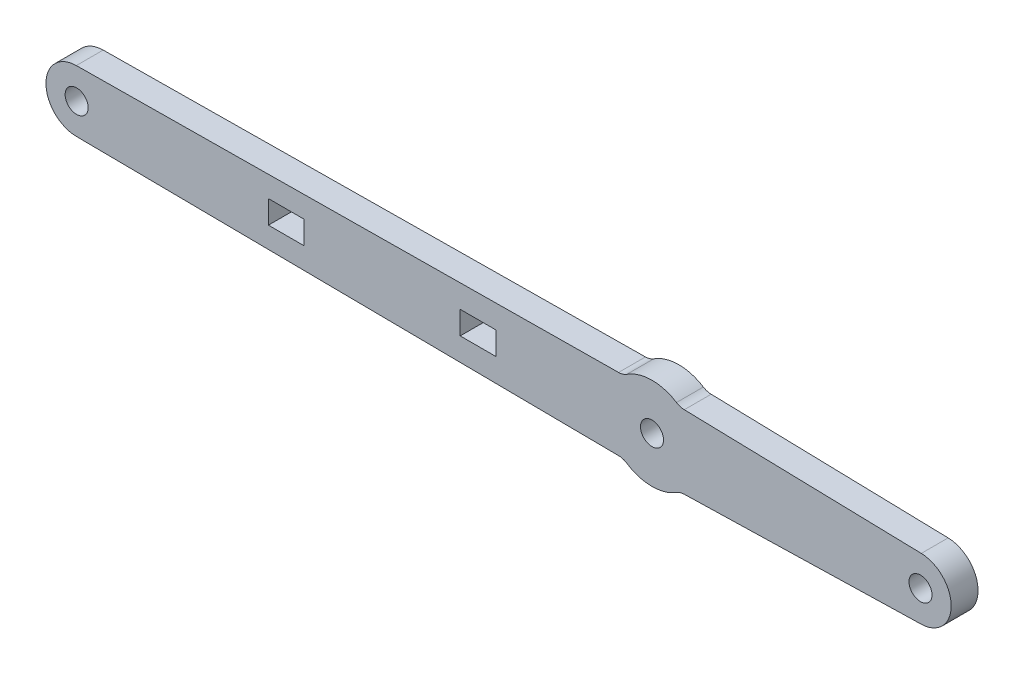
ISO-10303-21;
HEADER;
FILE_DESCRIPTION(('STEP AP214'),'2;1');
FILE_NAME('part.step','',(''),(''),'','','');
FILE_SCHEMA(('AUTOMOTIVE_DESIGN { 1 0 10303 214 1 1 1 1 }'));
ENDSEC;
DATA;
#1=APPLICATION_CONTEXT('core data for automotive mechanical design processes');
#2=APPLICATION_PROTOCOL_DEFINITION('international standard','automotive_design',2000,#1);
#3=PRODUCT_CONTEXT('',#1,'mechanical');
#4=PRODUCT('Part','Part','',(#3));
#5=PRODUCT_RELATED_PRODUCT_CATEGORY('part','',(#4));
#6=PRODUCT_DEFINITION_FORMATION('','',#4);
#7=PRODUCT_DEFINITION_CONTEXT('part definition',#1,'design');
#8=PRODUCT_DEFINITION('design','',#6,#7);
#9=PRODUCT_DEFINITION_SHAPE('','',#8);
#10=(LENGTH_UNIT() NAMED_UNIT(*) SI_UNIT(.MILLI.,.METRE.));
#11=(NAMED_UNIT(*) PLANE_ANGLE_UNIT() SI_UNIT($,.RADIAN.));
#12=(NAMED_UNIT(*) SI_UNIT($,.STERADIAN.) SOLID_ANGLE_UNIT());
#13=UNCERTAINTY_MEASURE_WITH_UNIT(LENGTH_MEASURE(1.E-05),#10,'distance_accuracy_value','');
#14=(GEOMETRIC_REPRESENTATION_CONTEXT(3) GLOBAL_UNCERTAINTY_ASSIGNED_CONTEXT((#13)) GLOBAL_UNIT_ASSIGNED_CONTEXT((#10,
#11,#12)) REPRESENTATION_CONTEXT('',''));
#15=CARTESIAN_POINT('',(0.,0.,0.));
#16=DIRECTION('',(0.,0.,1.));
#17=DIRECTION('',(1.,0.,0.));
#18=AXIS2_PLACEMENT_3D('',#15,#16,#17);
#19=CARTESIAN_POINT('',(-75.,0.,3.5));
#20=DIRECTION('',(0.,0.,1.));
#21=DIRECTION('',(1.,0.,0.));
#22=AXIS2_PLACEMENT_3D('',#19,#20,#21);
#23=PLANE('',#22);
#24=CARTESIAN_POINT('',(0.,0.,3.5));
#25=DIRECTION('',(0.,0.,1.));
#26=DIRECTION('',(1.,0.,0.));
#27=AXIS2_PLACEMENT_3D('',#24,#25,#26);
#28=CIRCLE('',#27,1.5);
#29=CARTESIAN_POINT('',(1.5,0.,3.5));
#30=VERTEX_POINT('',#29);
#31=EDGE_CURVE('E250',#30,#30,#28,.T.);
#32=ORIENTED_EDGE('',*,*,#31,.F.);
#33=EDGE_LOOP('',(#32));
#34=FACE_BOUND('',#33,.T.);
#35=CARTESIAN_POINT('',(-75.,0.,3.5));
#36=DIRECTION('',(0.,0.,1.));
#37=DIRECTION('',(1.,0.,0.));
#38=AXIS2_PLACEMENT_3D('',#35,#36,#37);
#39=CIRCLE('',#38,4.);
#40=CARTESIAN_POINT('',(-75.0394438018254,3.99980551858431,3.5));
#41=VERTEX_POINT('',#40);
#42=CARTESIAN_POINT('',(-75.0394438018254,-3.99980551858433,3.5));
#43=VERTEX_POINT('',#42);
#44=EDGE_CURVE('E262',#41,#43,#39,.T.);
#45=ORIENTED_EDGE('',*,*,#44,.T.);
#46=DIRECTION('',(0.999951379646079,-0.00986095045635901,0.));
#47=VECTOR('',#46,1.);
#48=CARTESIAN_POINT('',(-75.0394438018254,-3.99980551858433,3.5));
#49=LINE('',#48,#47);
#50=CARTESIAN_POINT('',(-4.35676827767334,-4.69683777000565,3.5));
#51=VERTEX_POINT('',#50);
#52=EDGE_CURVE('E265',#43,#51,#49,.T.);
#53=ORIENTED_EDGE('',*,*,#52,.T.);
#54=CARTESIAN_POINT('',(-4.37649017858604,-6.69674052929781,3.5));
#55=DIRECTION('',(0.,0.,1.));
#56=DIRECTION('',(1.,0.,0.));
#57=AXIS2_PLACEMENT_3D('',#54,#55,#56);
#58=CIRCLE('',#57,2.);
#59=CARTESIAN_POINT('',(-3.28236763393953,-5.02255539697336,3.5));
#60=VERTEX_POINT('',#59);
#61=EDGE_CURVE('E11',#51,#60,#58,.F.);
#62=ORIENTED_EDGE('',*,*,#61,.T.);
#63=CARTESIAN_POINT('',(0.,0.,3.5));
#64=DIRECTION('',(0.,0.,1.));
#65=DIRECTION('',(1.,0.,0.));
#66=AXIS2_PLACEMENT_3D('',#63,#64,#65);
#67=CIRCLE('',#66,6.);
#68=CARTESIAN_POINT('',(3.19437761320007,-5.07897151638855,3.5));
#69=VERTEX_POINT('',#68);
#70=EDGE_CURVE('E268',#60,#69,#67,.T.);
#71=ORIENTED_EDGE('',*,*,#70,.T.);
#72=CARTESIAN_POINT('',(4.25917015093343,-6.7719620218514,3.5));
#73=DIRECTION('',(0.,0.,1.));
#74=DIRECTION('',(1.,0.,0.));
#75=AXIS2_PLACEMENT_3D('',#72,#73,#74);
#76=CIRCLE('',#75,2.);
#77=CARTESIAN_POINT('',(4.20908443804376,-4.77258926486877,3.5));
#78=VERTEX_POINT('',#77);
#79=EDGE_CURVE('E334',#69,#78,#76,.F.);
#80=ORIENTED_EDGE('',*,*,#79,.T.);
#81=DIRECTION('',(0.999686378491316,0.0250428564448378,0.));
#82=VECTOR('',#81,1.);
#83=CARTESIAN_POINT('',(35.1001714257794,-3.99874551396527,3.5));
#84=LINE('',#83,#82);
#85=CARTESIAN_POINT('',(35.1001714257794,-3.99874551396527,3.5));
#86=VERTEX_POINT('',#85);
#87=EDGE_CURVE('E271',#78,#86,#84,.T.);
#88=ORIENTED_EDGE('',*,*,#87,.T.);
#89=CARTESIAN_POINT('',(35.,0.,3.5));
#90=DIRECTION('',(0.,0.,1.));
#91=DIRECTION('',(1.,0.,0.));
#92=AXIS2_PLACEMENT_3D('',#89,#90,#91);
#93=CIRCLE('',#92,4.);
#94=CARTESIAN_POINT('',(35.1001714257794,3.99874551396527,3.5));
#95=VERTEX_POINT('',#94);
#96=EDGE_CURVE('E273',#86,#95,#93,.T.);
#97=ORIENTED_EDGE('',*,*,#96,.T.);
#98=DIRECTION('',(-0.999686378491316,0.0250428564448378,0.));
#99=VECTOR('',#98,1.);
#100=CARTESIAN_POINT('',(35.1001714257794,3.99874551396527,3.5));
#101=LINE('',#100,#99);
#102=CARTESIAN_POINT('',(4.20908443804376,4.77258926486877,3.5));
#103=VERTEX_POINT('',#102);
#104=EDGE_CURVE('E275',#95,#103,#101,.T.);
#105=ORIENTED_EDGE('',*,*,#104,.T.);
#106=CARTESIAN_POINT('',(4.25917015093343,6.7719620218514,3.5));
#107=DIRECTION('',(0.,0.,1.));
#108=DIRECTION('',(1.,0.,0.));
#109=AXIS2_PLACEMENT_3D('',#106,#107,#108);
#110=CIRCLE('',#109,2.);
#111=CARTESIAN_POINT('',(3.19437761320007,5.07897151638855,3.5));
#112=VERTEX_POINT('',#111);
#113=EDGE_CURVE('E342',#103,#112,#110,.F.);
#114=ORIENTED_EDGE('',*,*,#113,.T.);
#115=CARTESIAN_POINT('',(0.,0.,3.5));
#116=DIRECTION('',(0.,0.,1.));
#117=DIRECTION('',(1.,0.,0.));
#118=AXIS2_PLACEMENT_3D('',#115,#116,#117);
#119=CIRCLE('',#118,6.);
#120=CARTESIAN_POINT('',(-3.28236763393953,5.02255539697336,3.5));
#121=VERTEX_POINT('',#120);
#122=EDGE_CURVE('E278',#112,#121,#119,.T.);
#123=ORIENTED_EDGE('',*,*,#122,.T.);
#124=CARTESIAN_POINT('',(-4.37649017858605,6.69674052929781,3.5));
#125=DIRECTION('',(0.,0.,1.));
#126=DIRECTION('',(1.,0.,0.));
#127=AXIS2_PLACEMENT_3D('',#124,#125,#126);
#128=CIRCLE('',#127,2.);
#129=CARTESIAN_POINT('',(-4.35676827767334,4.69683777000565,3.5));
#130=VERTEX_POINT('',#129);
#131=EDGE_CURVE('E338',#121,#130,#128,.F.);
#132=ORIENTED_EDGE('',*,*,#131,.T.);
#133=DIRECTION('',(-0.999951379646079,-0.00986095045635926,0.));
#134=VECTOR('',#133,1.);
#135=CARTESIAN_POINT('',(-75.0394438018254,3.99980551858431,3.5));
#136=LINE('',#135,#134);
#137=EDGE_CURVE('E281',#130,#41,#136,.T.);
#138=ORIENTED_EDGE('',*,*,#137,.T.);
#139=EDGE_LOOP('',(#45,#53,#62,#71,#80,#88,#97,#105,#114,#123,#132,#138));
#140=FACE_BOUND('',#139,.T.);
#141=CARTESIAN_POINT('',(-75.,0.,3.5));
#142=DIRECTION('',(0.,0.,1.));
#143=DIRECTION('',(1.,0.,0.));
#144=AXIS2_PLACEMENT_3D('',#141,#142,#143);
#145=CIRCLE('',#144,1.5);
#146=CARTESIAN_POINT('',(-73.5,0.,3.5));
#147=VERTEX_POINT('',#146);
#148=EDGE_CURVE('E256',#147,#147,#145,.T.);
#149=ORIENTED_EDGE('',*,*,#148,.F.);
#150=EDGE_LOOP('',(#149));
#151=FACE_BOUND('',#150,.T.);
#152=CARTESIAN_POINT('',(35.,0.,3.5));
#153=DIRECTION('',(0.,0.,1.));
#154=DIRECTION('',(1.,0.,0.));
#155=AXIS2_PLACEMENT_3D('',#152,#153,#154);
#156=CIRCLE('',#155,1.5);
#157=CARTESIAN_POINT('',(36.5,0.,3.5));
#158=VERTEX_POINT('',#157);
#159=EDGE_CURVE('E244',#158,#158,#156,.T.);
#160=ORIENTED_EDGE('',*,*,#159,.F.);
#161=EDGE_LOOP('',(#160));
#162=FACE_BOUND('',#161,.T.);
#163=DIRECTION('',(1.,0.,0.));
#164=VECTOR('',#163,1.);
#165=CARTESIAN_POINT('',(-50.,-1.49999999999469,3.5));
#166=LINE('',#165,#164);
#167=CARTESIAN_POINT('',(-50.,-1.49999999999469,3.5));
#168=VERTEX_POINT('',#167);
#169=CARTESIAN_POINT('',(-45.3649163380924,-1.49999999999469,3.5));
#170=VERTEX_POINT('',#169);
#171=EDGE_CURVE('E215',#168,#170,#166,.T.);
#172=ORIENTED_EDGE('',*,*,#171,.F.);
#173=DIRECTION('',(0.,-1.,0.));
#174=VECTOR('',#173,1.);
#175=CARTESIAN_POINT('',(-50.,1.50000000000531,3.5));
#176=LINE('',#175,#174);
#177=CARTESIAN_POINT('',(-50.,1.50000000000531,3.5));
#178=VERTEX_POINT('',#177);
#179=EDGE_CURVE('E213',#178,#168,#176,.T.);
#180=ORIENTED_EDGE('',*,*,#179,.F.);
#181=DIRECTION('',(-1.,0.,0.));
#182=VECTOR('',#181,1.);
#183=CARTESIAN_POINT('',(-45.3649163380924,1.50000000000531,3.5));
#184=LINE('',#183,#182);
#185=CARTESIAN_POINT('',(-45.3649163380924,1.50000000000531,3.5));
#186=VERTEX_POINT('',#185);
#187=EDGE_CURVE('E221',#186,#178,#184,.T.);
#188=ORIENTED_EDGE('',*,*,#187,.F.);
#189=DIRECTION('',(0.,1.,0.));
#190=VECTOR('',#189,1.);
#191=CARTESIAN_POINT('',(-45.3649163380924,-1.49999999999469,3.5));
#192=LINE('',#191,#190);
#193=EDGE_CURVE('E218',#170,#186,#192,.T.);
#194=ORIENTED_EDGE('',*,*,#193,.F.);
#195=EDGE_LOOP('',(#172,#180,#188,#194));
#196=FACE_BOUND('',#195,.T.);
#197=DIRECTION('',(1.,0.,0.));
#198=VECTOR('',#197,1.);
#199=CARTESIAN_POINT('',(-25.,-1.49999999999468,3.5));
#200=LINE('',#199,#198);
#201=CARTESIAN_POINT('',(-25.,-1.49999999999468,3.5));
#202=VERTEX_POINT('',#201);
#203=CARTESIAN_POINT('',(-20.3649163380924,-1.49999999999468,3.5));
#204=VERTEX_POINT('',#203);
#205=EDGE_CURVE('E182',#202,#204,#200,.T.);
#206=ORIENTED_EDGE('',*,*,#205,.F.);
#207=DIRECTION('',(0.,-1.,0.));
#208=VECTOR('',#207,1.);
#209=CARTESIAN_POINT('',(-25.,1.50000000000531,3.5));
#210=LINE('',#209,#208);
#211=CARTESIAN_POINT('',(-25.,1.50000000000531,3.5));
#212=VERTEX_POINT('',#211);
#213=EDGE_CURVE('E172',#212,#202,#210,.T.);
#214=ORIENTED_EDGE('',*,*,#213,.F.);
#215=DIRECTION('',(-1.,0.,0.));
#216=VECTOR('',#215,1.);
#217=CARTESIAN_POINT('',(-20.3649163380924,1.50000000000531,3.5));
#218=LINE('',#217,#216);
#219=CARTESIAN_POINT('',(-20.3649163380924,1.50000000000531,3.5));
#220=VERTEX_POINT('',#219);
#221=EDGE_CURVE('E197',#220,#212,#218,.T.);
#222=ORIENTED_EDGE('',*,*,#221,.F.);
#223=DIRECTION('',(0.,1.,0.));
#224=VECTOR('',#223,1.);
#225=CARTESIAN_POINT('',(-20.3649163380924,-1.49999999999468,3.5));
#226=LINE('',#225,#224);
#227=EDGE_CURVE('E195',#204,#220,#226,.T.);
#228=ORIENTED_EDGE('',*,*,#227,.F.);
#229=EDGE_LOOP('',(#206,#214,#222,#228));
#230=FACE_BOUND('',#229,.T.);
#231=ADVANCED_FACE('F36',(#34,#140,#151,#162,#196,#230),#23,.T.);
#232=CARTESIAN_POINT('',(-75.,0.,0.));
#233=DIRECTION('',(0.,0.,1.));
#234=DIRECTION('',(1.,0.,0.));
#235=AXIS2_PLACEMENT_3D('',#232,#233,#234);
#236=PLANE('',#235);
#237=DIRECTION('',(0.,-1.,0.));
#238=VECTOR('',#237,1.);
#239=CARTESIAN_POINT('',(-50.,1.50000000000531,0.));
#240=LINE('',#239,#238);
#241=CARTESIAN_POINT('',(-50.,1.50000000000531,0.));
#242=VERTEX_POINT('',#241);
#243=CARTESIAN_POINT('',(-50.,-1.49999999999469,0.));
#244=VERTEX_POINT('',#243);
#245=EDGE_CURVE('E190',#242,#244,#240,.T.);
#246=ORIENTED_EDGE('',*,*,#245,.T.);
#247=DIRECTION('',(1.,0.,0.));
#248=VECTOR('',#247,1.);
#249=CARTESIAN_POINT('',(-50.,-1.49999999999469,0.));
#250=LINE('',#249,#248);
#251=CARTESIAN_POINT('',(-45.3649163380924,-1.49999999999469,0.));
#252=VERTEX_POINT('',#251);
#253=EDGE_CURVE('E226',#244,#252,#250,.T.);
#254=ORIENTED_EDGE('',*,*,#253,.T.);
#255=DIRECTION('',(0.,1.,0.));
#256=VECTOR('',#255,1.);
#257=CARTESIAN_POINT('',(-45.3649163380924,-1.49999999999469,0.));
#258=LINE('',#257,#256);
#259=CARTESIAN_POINT('',(-45.3649163380924,1.50000000000531,0.));
#260=VERTEX_POINT('',#259);
#261=EDGE_CURVE('E229',#252,#260,#258,.T.);
#262=ORIENTED_EDGE('',*,*,#261,.T.);
#263=DIRECTION('',(-1.,0.,0.));
#264=VECTOR('',#263,1.);
#265=CARTESIAN_POINT('',(-45.3649163380924,1.50000000000531,0.));
#266=LINE('',#265,#264);
#267=EDGE_CURVE('E216',#260,#242,#266,.T.);
#268=ORIENTED_EDGE('',*,*,#267,.T.);
#269=EDGE_LOOP('',(#246,#254,#262,#268));
#270=FACE_BOUND('',#269,.T.);
#271=CARTESIAN_POINT('',(-75.,0.,0.));
#272=DIRECTION('',(0.,0.,1.));
#273=DIRECTION('',(1.,0.,0.));
#274=AXIS2_PLACEMENT_3D('',#271,#272,#273);
#275=CIRCLE('',#274,4.);
#276=CARTESIAN_POINT('',(-75.0394438018254,3.99980551858431,0.));
#277=VERTEX_POINT('',#276);
#278=CARTESIAN_POINT('',(-75.0394438018254,-3.99980551858433,0.));
#279=VERTEX_POINT('',#278);
#280=EDGE_CURVE('E259',#277,#279,#275,.T.);
#281=ORIENTED_EDGE('',*,*,#280,.F.);
#282=DIRECTION('',(-0.999951379646079,-0.00986095045635926,0.));
#283=VECTOR('',#282,1.);
#284=CARTESIAN_POINT('',(-75.0394438018254,3.99980551858431,0.));
#285=LINE('',#284,#283);
#286=CARTESIAN_POINT('',(-4.35676827767334,4.69683777000565,0.));
#287=VERTEX_POINT('',#286);
#288=EDGE_CURVE('E266',#287,#277,#285,.T.);
#289=ORIENTED_EDGE('',*,*,#288,.F.);
#290=CARTESIAN_POINT('',(-4.37649017858605,6.69674052929781,0.));
#291=DIRECTION('',(0.,0.,1.));
#292=DIRECTION('',(1.,0.,0.));
#293=AXIS2_PLACEMENT_3D('',#290,#291,#292);
#294=CIRCLE('',#293,2.);
#295=CARTESIAN_POINT('',(-3.28236763393953,5.02255539697336,0.));
#296=VERTEX_POINT('',#295);
#297=EDGE_CURVE('E336',#287,#296,#294,.T.);
#298=ORIENTED_EDGE('',*,*,#297,.T.);
#299=CARTESIAN_POINT('',(0.,0.,0.));
#300=DIRECTION('',(0.,0.,1.));
#301=DIRECTION('',(1.,0.,0.));
#302=AXIS2_PLACEMENT_3D('',#299,#300,#301);
#303=CIRCLE('',#302,6.);
#304=CARTESIAN_POINT('',(3.19437761320007,5.07897151638855,0.));
#305=VERTEX_POINT('',#304);
#306=EDGE_CURVE('E298',#305,#296,#303,.T.);
#307=ORIENTED_EDGE('',*,*,#306,.F.);
#308=CARTESIAN_POINT('',(4.25917015093343,6.7719620218514,0.));
#309=DIRECTION('',(0.,0.,1.));
#310=DIRECTION('',(1.,0.,0.));
#311=AXIS2_PLACEMENT_3D('',#308,#309,#310);
#312=CIRCLE('',#311,2.);
#313=CARTESIAN_POINT('',(4.20908443804376,4.77258926486877,0.));
#314=VERTEX_POINT('',#313);
#315=EDGE_CURVE('E340',#305,#314,#312,.T.);
#316=ORIENTED_EDGE('',*,*,#315,.T.);
#317=DIRECTION('',(-0.999686378491316,0.0250428564448378,0.));
#318=VECTOR('',#317,1.);
#319=CARTESIAN_POINT('',(35.1001714257794,3.99874551396527,0.));
#320=LINE('',#319,#318);
#321=CARTESIAN_POINT('',(35.1001714257794,3.99874551396527,0.));
#322=VERTEX_POINT('',#321);
#323=EDGE_CURVE('E295',#322,#314,#320,.T.);
#324=ORIENTED_EDGE('',*,*,#323,.F.);
#325=CARTESIAN_POINT('',(35.,0.,0.));
#326=DIRECTION('',(0.,0.,1.));
#327=DIRECTION('',(1.,0.,0.));
#328=AXIS2_PLACEMENT_3D('',#325,#326,#327);
#329=CIRCLE('',#328,4.);
#330=CARTESIAN_POINT('',(35.1001714257794,-3.99874551396527,0.));
#331=VERTEX_POINT('',#330);
#332=EDGE_CURVE('E293',#331,#322,#329,.T.);
#333=ORIENTED_EDGE('',*,*,#332,.F.);
#334=DIRECTION('',(0.999686378491316,0.0250428564448378,0.));
#335=VECTOR('',#334,1.);
#336=CARTESIAN_POINT('',(35.1001714257794,-3.99874551396527,0.));
#337=LINE('',#336,#335);
#338=CARTESIAN_POINT('',(4.20908443804376,-4.77258926486877,0.));
#339=VERTEX_POINT('',#338);
#340=EDGE_CURVE('E291',#339,#331,#337,.T.);
#341=ORIENTED_EDGE('',*,*,#340,.F.);
#342=CARTESIAN_POINT('',(4.25917015093343,-6.7719620218514,0.));
#343=DIRECTION('',(0.,0.,1.));
#344=DIRECTION('',(1.,0.,0.));
#345=AXIS2_PLACEMENT_3D('',#342,#343,#344);
#346=CIRCLE('',#345,2.);
#347=CARTESIAN_POINT('',(3.19437761320007,-5.07897151638855,0.));
#348=VERTEX_POINT('',#347);
#349=EDGE_CURVE('E332',#339,#348,#346,.T.);
#350=ORIENTED_EDGE('',*,*,#349,.T.);
#351=CARTESIAN_POINT('',(0.,0.,0.));
#352=DIRECTION('',(0.,0.,1.));
#353=DIRECTION('',(1.,0.,0.));
#354=AXIS2_PLACEMENT_3D('',#351,#352,#353);
#355=CIRCLE('',#354,6.);
#356=CARTESIAN_POINT('',(-3.28236763393953,-5.02255539697336,0.));
#357=VERTEX_POINT('',#356);
#358=EDGE_CURVE('E288',#357,#348,#355,.T.);
#359=ORIENTED_EDGE('',*,*,#358,.F.);
#360=CARTESIAN_POINT('',(-4.37649017858604,-6.69674052929781,0.));
#361=DIRECTION('',(0.,0.,1.));
#362=DIRECTION('',(1.,0.,0.));
#363=AXIS2_PLACEMENT_3D('',#360,#361,#362);
#364=CIRCLE('',#363,2.);
#365=CARTESIAN_POINT('',(-4.35676827767334,-4.69683777000565,0.));
#366=VERTEX_POINT('',#365);
#367=EDGE_CURVE('E44',#357,#366,#364,.T.);
#368=ORIENTED_EDGE('',*,*,#367,.T.);
#369=DIRECTION('',(0.999951379646079,-0.00986095045635901,0.));
#370=VECTOR('',#369,1.);
#371=CARTESIAN_POINT('',(-75.0394438018254,-3.99980551858433,0.));
#372=LINE('',#371,#370);
#373=EDGE_CURVE('E286',#279,#366,#372,.T.);
#374=ORIENTED_EDGE('',*,*,#373,.F.);
#375=EDGE_LOOP('',(#281,#289,#298,#307,#316,#324,#333,#341,#350,#359,#368,#374));
#376=FACE_BOUND('',#375,.T.);
#377=CARTESIAN_POINT('',(-75.,0.,0.));
#378=DIRECTION('',(0.,0.,1.));
#379=DIRECTION('',(1.,0.,0.));
#380=AXIS2_PLACEMENT_3D('',#377,#378,#379);
#381=CIRCLE('',#380,1.5);
#382=CARTESIAN_POINT('',(-73.5,0.,0.));
#383=VERTEX_POINT('',#382);
#384=EDGE_CURVE('E253',#383,#383,#381,.T.);
#385=ORIENTED_EDGE('',*,*,#384,.T.);
#386=EDGE_LOOP('',(#385));
#387=FACE_BOUND('',#386,.T.);
#388=CARTESIAN_POINT('',(0.,0.,0.));
#389=DIRECTION('',(0.,0.,1.));
#390=DIRECTION('',(1.,0.,0.));
#391=AXIS2_PLACEMENT_3D('',#388,#389,#390);
#392=CIRCLE('',#391,1.5);
#393=CARTESIAN_POINT('',(1.5,0.,0.));
#394=VERTEX_POINT('',#393);
#395=EDGE_CURVE('E247',#394,#394,#392,.T.);
#396=ORIENTED_EDGE('',*,*,#395,.T.);
#397=EDGE_LOOP('',(#396));
#398=FACE_BOUND('',#397,.T.);
#399=CARTESIAN_POINT('',(35.,0.,0.));
#400=DIRECTION('',(0.,0.,1.));
#401=DIRECTION('',(1.,0.,0.));
#402=AXIS2_PLACEMENT_3D('',#399,#400,#401);
#403=CIRCLE('',#402,1.5);
#404=CARTESIAN_POINT('',(36.5,0.,0.));
#405=VERTEX_POINT('',#404);
#406=EDGE_CURVE('E243',#405,#405,#403,.T.);
#407=ORIENTED_EDGE('',*,*,#406,.T.);
#408=EDGE_LOOP('',(#407));
#409=FACE_BOUND('',#408,.T.);
#410=DIRECTION('',(0.,-1.,0.));
#411=VECTOR('',#410,1.);
#412=CARTESIAN_POINT('',(-25.,1.50000000000531,0.));
#413=LINE('',#412,#411);
#414=CARTESIAN_POINT('',(-25.,1.50000000000531,0.));
#415=VERTEX_POINT('',#414);
#416=CARTESIAN_POINT('',(-25.,-1.49999999999468,0.));
#417=VERTEX_POINT('',#416);
#418=EDGE_CURVE('E201',#415,#417,#413,.T.);
#419=ORIENTED_EDGE('',*,*,#418,.T.);
#420=DIRECTION('',(1.,0.,0.));
#421=VECTOR('',#420,1.);
#422=CARTESIAN_POINT('',(-25.,-1.49999999999468,0.));
#423=LINE('',#422,#421);
#424=CARTESIAN_POINT('',(-20.3649163380924,-1.49999999999468,0.));
#425=VERTEX_POINT('',#424);
#426=EDGE_CURVE('E189',#417,#425,#423,.T.);
#427=ORIENTED_EDGE('',*,*,#426,.T.);
#428=DIRECTION('',(0.,1.,0.));
#429=VECTOR('',#428,1.);
#430=CARTESIAN_POINT('',(-20.3649163380924,-1.49999999999468,0.));
#431=LINE('',#430,#429);
#432=CARTESIAN_POINT('',(-20.3649163380924,1.50000000000531,0.));
#433=VERTEX_POINT('',#432);
#434=EDGE_CURVE('E204',#425,#433,#431,.T.);
#435=ORIENTED_EDGE('',*,*,#434,.T.);
#436=DIRECTION('',(-1.,0.,0.));
#437=VECTOR('',#436,1.);
#438=CARTESIAN_POINT('',(-20.3649163380924,1.50000000000531,0.));
#439=LINE('',#438,#437);
#440=EDGE_CURVE('E183',#433,#415,#439,.T.);
#441=ORIENTED_EDGE('',*,*,#440,.T.);
#442=EDGE_LOOP('',(#419,#427,#435,#441));
#443=FACE_BOUND('',#442,.T.);
#444=ADVANCED_FACE('F359',(#270,#376,#387,#398,#409,#443),#236,.F.);
#445=CARTESIAN_POINT('',(-75.,0.,3.5));
#446=DIRECTION('',(0.,0.,-1.));
#447=DIRECTION('',(-1.,0.,0.));
#448=AXIS2_PLACEMENT_3D('',#445,#446,#447);
#449=CYLINDRICAL_SURFACE('',#448,4.);
#450=ORIENTED_EDGE('',*,*,#280,.T.);
#451=DIRECTION('',(0.,0.,-1.));
#452=VECTOR('',#451,1.);
#453=CARTESIAN_POINT('',(-75.0394438018254,-3.99980551858433,3.5));
#454=LINE('',#453,#452);
#455=EDGE_CURVE('E310',#43,#279,#454,.T.);
#456=ORIENTED_EDGE('',*,*,#455,.F.);
#457=ORIENTED_EDGE('',*,*,#44,.F.);
#458=DIRECTION('',(0.,0.,-1.));
#459=VECTOR('',#458,1.);
#460=CARTESIAN_POINT('',(-75.0394438018254,3.99980551858431,3.5));
#461=LINE('',#460,#459);
#462=EDGE_CURVE('E283',#41,#277,#461,.T.);
#463=ORIENTED_EDGE('',*,*,#462,.T.);
#464=EDGE_LOOP('',(#450,#456,#457,#463));
#465=FACE_BOUND('',#464,.T.);
#466=ADVANCED_FACE('F395',(#465),#449,.T.);
#467=CARTESIAN_POINT('',(-75.0394438018254,-3.99980551858433,3.5));
#468=DIRECTION('',(0.00986095045635902,0.999951379646079,0.));
#469=DIRECTION('',(-0.999951379646079,0.00986095045635902,0.));
#470=AXIS2_PLACEMENT_3D('',#467,#468,#469);
#471=PLANE('',#470);
#472=ORIENTED_EDGE('',*,*,#373,.T.);
#473=DIRECTION('',(0.,0.,1.));
#474=VECTOR('',#473,1.);
#475=CARTESIAN_POINT('',(-4.35676827767332,-4.69683777000565,3.5));
#476=LINE('',#475,#474);
#477=EDGE_CURVE('E51',#366,#51,#476,.T.);
#478=ORIENTED_EDGE('',*,*,#477,.T.);
#479=ORIENTED_EDGE('',*,*,#52,.F.);
#480=ORIENTED_EDGE('',*,*,#455,.T.);
#481=EDGE_LOOP('',(#472,#478,#479,#480));
#482=FACE_BOUND('',#481,.T.);
#483=ADVANCED_FACE('F417',(#482),#471,.F.);
#484=CARTESIAN_POINT('',(0.,0.,3.5));
#485=DIRECTION('',(0.,0.,-1.));
#486=DIRECTION('',(-1.,0.,0.));
#487=AXIS2_PLACEMENT_3D('',#484,#485,#486);
#488=CYLINDRICAL_SURFACE('',#487,6.);
#489=ORIENTED_EDGE('',*,*,#358,.T.);
#490=DIRECTION('',(0.,0.,-1.));
#491=VECTOR('',#490,1.);
#492=CARTESIAN_POINT('',(3.19437761320007,-5.07897151638855,3.5));
#493=LINE('',#492,#491);
#494=EDGE_CURVE('E319',#348,#69,#493,.F.);
#495=ORIENTED_EDGE('',*,*,#494,.T.);
#496=ORIENTED_EDGE('',*,*,#70,.F.);
#497=DIRECTION('',(0.,0.,-1.));
#498=VECTOR('',#497,1.);
#499=CARTESIAN_POINT('',(-3.28236763393953,-5.02255539697336,3.5));
#500=LINE('',#499,#498);
#501=EDGE_CURVE('E316',#60,#357,#500,.T.);
#502=ORIENTED_EDGE('',*,*,#501,.T.);
#503=EDGE_LOOP('',(#489,#495,#496,#502));
#504=FACE_BOUND('',#503,.T.);
#505=ADVANCED_FACE('F380',(#504),#488,.T.);
#506=CARTESIAN_POINT('',(35.1001714257794,-3.99874551396527,3.5));
#507=DIRECTION('',(-0.0250428564448378,0.999686378491316,0.));
#508=DIRECTION('',(-0.999686378491316,-0.0250428564448378,0.));
#509=AXIS2_PLACEMENT_3D('',#506,#507,#508);
#510=PLANE('',#509);
#511=ORIENTED_EDGE('',*,*,#87,.F.);
#512=DIRECTION('',(0.,0.,1.));
#513=VECTOR('',#512,1.);
#514=CARTESIAN_POINT('',(4.20908443804375,-4.77258926486877,0.));
#515=LINE('',#514,#513);
#516=EDGE_CURVE('E313',#78,#339,#515,.F.);
#517=ORIENTED_EDGE('',*,*,#516,.T.);
#518=ORIENTED_EDGE('',*,*,#340,.T.);
#519=DIRECTION('',(0.,0.,-1.));
#520=VECTOR('',#519,1.);
#521=CARTESIAN_POINT('',(35.1001714257794,-3.99874551396527,3.5));
#522=LINE('',#521,#520);
#523=EDGE_CURVE('E307',#86,#331,#522,.T.);
#524=ORIENTED_EDGE('',*,*,#523,.F.);
#525=EDGE_LOOP('',(#511,#517,#518,#524));
#526=FACE_BOUND('',#525,.T.);
#527=ADVANCED_FACE('F372',(#526),#510,.F.);
#528=CARTESIAN_POINT('',(35.,0.,3.5));
#529=DIRECTION('',(0.,0.,-1.));
#530=DIRECTION('',(-1.,0.,0.));
#531=AXIS2_PLACEMENT_3D('',#528,#529,#530);
#532=CYLINDRICAL_SURFACE('',#531,4.);
#533=ORIENTED_EDGE('',*,*,#332,.T.);
#534=DIRECTION('',(0.,0.,-1.));
#535=VECTOR('',#534,1.);
#536=CARTESIAN_POINT('',(35.1001714257794,3.99874551396527,3.5));
#537=LINE('',#536,#535);
#538=EDGE_CURVE('E304',#95,#322,#537,.T.);
#539=ORIENTED_EDGE('',*,*,#538,.F.);
#540=ORIENTED_EDGE('',*,*,#96,.F.);
#541=ORIENTED_EDGE('',*,*,#523,.T.);
#542=EDGE_LOOP('',(#533,#539,#540,#541));
#543=FACE_BOUND('',#542,.T.);
#544=ADVANCED_FACE('F367',(#543),#532,.T.);
#545=CARTESIAN_POINT('',(35.1001714257794,3.99874551396527,3.5));
#546=DIRECTION('',(-0.0250428564448378,-0.999686378491316,0.));
#547=DIRECTION('',(0.999686378491316,-0.0250428564448378,0.));
#548=AXIS2_PLACEMENT_3D('',#545,#546,#547);
#549=PLANE('',#548);
#550=ORIENTED_EDGE('',*,*,#323,.T.);
#551=DIRECTION('',(0.,0.,1.));
#552=VECTOR('',#551,1.);
#553=CARTESIAN_POINT('',(4.20908443804375,4.77258926486877,3.5));
#554=LINE('',#553,#552);
#555=EDGE_CURVE('E329',#314,#103,#554,.T.);
#556=ORIENTED_EDGE('',*,*,#555,.T.);
#557=ORIENTED_EDGE('',*,*,#104,.F.);
#558=ORIENTED_EDGE('',*,*,#538,.T.);
#559=EDGE_LOOP('',(#550,#556,#557,#558));
#560=FACE_BOUND('',#559,.T.);
#561=ADVANCED_FACE('F363',(#560),#549,.F.);
#562=CARTESIAN_POINT('',(0.,0.,3.5));
#563=DIRECTION('',(0.,0.,-1.));
#564=DIRECTION('',(-1.,0.,0.));
#565=AXIS2_PLACEMENT_3D('',#562,#563,#564);
#566=CYLINDRICAL_SURFACE('',#565,6.);
#567=ORIENTED_EDGE('',*,*,#306,.T.);
#568=DIRECTION('',(0.,0.,-1.));
#569=VECTOR('',#568,1.);
#570=CARTESIAN_POINT('',(-3.28236763393953,5.02255539697336,3.5));
#571=LINE('',#570,#569);
#572=EDGE_CURVE('E327',#296,#121,#571,.F.);
#573=ORIENTED_EDGE('',*,*,#572,.T.);
#574=ORIENTED_EDGE('',*,*,#122,.F.);
#575=DIRECTION('',(0.,0.,-1.));
#576=VECTOR('',#575,1.);
#577=CARTESIAN_POINT('',(3.19437761320007,5.07897151638855,3.5));
#578=LINE('',#577,#576);
#579=EDGE_CURVE('E324',#112,#305,#578,.T.);
#580=ORIENTED_EDGE('',*,*,#579,.T.);
#581=EDGE_LOOP('',(#567,#573,#574,#580));
#582=FACE_BOUND('',#581,.T.);
#583=ADVANCED_FACE('F353',(#582),#566,.T.);
#584=CARTESIAN_POINT('',(-75.0394438018254,3.99980551858431,3.5));
#585=DIRECTION('',(0.00986095045635926,-0.999951379646079,0.));
#586=DIRECTION('',(0.999951379646079,0.00986095045635926,0.));
#587=AXIS2_PLACEMENT_3D('',#584,#585,#586);
#588=PLANE('',#587);
#589=ORIENTED_EDGE('',*,*,#137,.F.);
#590=DIRECTION('',(0.,0.,1.));
#591=VECTOR('',#590,1.);
#592=CARTESIAN_POINT('',(-4.35676827767333,4.69683777000565,0.));
#593=LINE('',#592,#591);
#594=EDGE_CURVE('E321',#130,#287,#593,.F.);
#595=ORIENTED_EDGE('',*,*,#594,.T.);
#596=ORIENTED_EDGE('',*,*,#288,.T.);
#597=ORIENTED_EDGE('',*,*,#462,.F.);
#598=EDGE_LOOP('',(#589,#595,#596,#597));
#599=FACE_BOUND('',#598,.T.);
#600=ADVANCED_FACE('F403',(#599),#588,.F.);
#601=CARTESIAN_POINT('',(-75.,0.,3.5));
#602=DIRECTION('',(0.,0.,-1.));
#603=DIRECTION('',(-1.,0.,0.));
#604=AXIS2_PLACEMENT_3D('',#601,#602,#603);
#605=CYLINDRICAL_SURFACE('',#604,1.5);
#606=ORIENTED_EDGE('',*,*,#148,.T.);
#607=EDGE_LOOP('',(#606));
#608=FACE_BOUND('',#607,.T.);
#609=ORIENTED_EDGE('',*,*,#384,.F.);
#610=EDGE_LOOP('',(#609));
#611=FACE_BOUND('',#610,.T.);
#612=ADVANCED_FACE('F400',(#608,#611),#605,.F.);
#613=CARTESIAN_POINT('',(0.,0.,3.5));
#614=DIRECTION('',(0.,0.,-1.));
#615=DIRECTION('',(-1.,0.,0.));
#616=AXIS2_PLACEMENT_3D('',#613,#614,#615);
#617=CYLINDRICAL_SURFACE('',#616,1.5);
#618=ORIENTED_EDGE('',*,*,#31,.T.);
#619=EDGE_LOOP('',(#618));
#620=FACE_BOUND('',#619,.T.);
#621=ORIENTED_EDGE('',*,*,#395,.F.);
#622=EDGE_LOOP('',(#621));
#623=FACE_BOUND('',#622,.T.);
#624=ADVANCED_FACE('F531',(#620,#623),#617,.F.);
#625=CARTESIAN_POINT('',(35.,0.,3.5));
#626=DIRECTION('',(0.,0.,-1.));
#627=DIRECTION('',(-1.,0.,0.));
#628=AXIS2_PLACEMENT_3D('',#625,#626,#627);
#629=CYLINDRICAL_SURFACE('',#628,1.5);
#630=ORIENTED_EDGE('',*,*,#159,.T.);
#631=EDGE_LOOP('',(#630));
#632=FACE_BOUND('',#631,.T.);
#633=ORIENTED_EDGE('',*,*,#406,.F.);
#634=EDGE_LOOP('',(#633));
#635=FACE_BOUND('',#634,.T.);
#636=ADVANCED_FACE('F522',(#632,#635),#629,.F.);
#637=CARTESIAN_POINT('',(-50.,1.50000000000531,3.5));
#638=DIRECTION('',(1.,0.,0.));
#639=DIRECTION('',(0.,0.,-1.));
#640=AXIS2_PLACEMENT_3D('',#637,#638,#639);
#641=PLANE('',#640);
#642=ORIENTED_EDGE('',*,*,#245,.F.);
#643=DIRECTION('',(0.,0.,-1.));
#644=VECTOR('',#643,1.);
#645=CARTESIAN_POINT('',(-50.,1.50000000000531,3.5));
#646=LINE('',#645,#644);
#647=EDGE_CURVE('E223',#178,#242,#646,.T.);
#648=ORIENTED_EDGE('',*,*,#647,.F.);
#649=ORIENTED_EDGE('',*,*,#179,.T.);
#650=DIRECTION('',(0.,0.,-1.));
#651=VECTOR('',#650,1.);
#652=CARTESIAN_POINT('',(-50.,-1.49999999999469,3.5));
#653=LINE('',#652,#651);
#654=EDGE_CURVE('E240',#168,#244,#653,.T.);
#655=ORIENTED_EDGE('',*,*,#654,.T.);
#656=EDGE_LOOP('',(#642,#648,#649,#655));
#657=FACE_BOUND('',#656,.T.);
#658=ADVANCED_FACE('F513',(#657),#641,.T.);
#659=CARTESIAN_POINT('',(-50.,-1.49999999999469,3.5));
#660=DIRECTION('',(0.,1.,0.));
#661=DIRECTION('',(0.,0.,1.));
#662=AXIS2_PLACEMENT_3D('',#659,#660,#661);
#663=PLANE('',#662);
#664=ORIENTED_EDGE('',*,*,#253,.F.);
#665=ORIENTED_EDGE('',*,*,#654,.F.);
#666=ORIENTED_EDGE('',*,*,#171,.T.);
#667=DIRECTION('',(0.,0.,-1.));
#668=VECTOR('',#667,1.);
#669=CARTESIAN_POINT('',(-45.3649163380924,-1.49999999999469,3.5));
#670=LINE('',#669,#668);
#671=EDGE_CURVE('E238',#170,#252,#670,.T.);
#672=ORIENTED_EDGE('',*,*,#671,.T.);
#673=EDGE_LOOP('',(#664,#665,#666,#672));
#674=FACE_BOUND('',#673,.T.);
#675=ADVANCED_FACE('F504',(#674),#663,.T.);
#676=CARTESIAN_POINT('',(-45.3649163380924,-1.49999999999469,3.5));
#677=DIRECTION('',(-1.,0.,0.));
#678=DIRECTION('',(0.,0.,1.));
#679=AXIS2_PLACEMENT_3D('',#676,#677,#678);
#680=PLANE('',#679);
#681=ORIENTED_EDGE('',*,*,#261,.F.);
#682=ORIENTED_EDGE('',*,*,#671,.F.);
#683=ORIENTED_EDGE('',*,*,#193,.T.);
#684=DIRECTION('',(0.,0.,-1.));
#685=VECTOR('',#684,1.);
#686=CARTESIAN_POINT('',(-45.3649163380924,1.50000000000531,3.5));
#687=LINE('',#686,#685);
#688=EDGE_CURVE('E236',#186,#260,#687,.T.);
#689=ORIENTED_EDGE('',*,*,#688,.T.);
#690=EDGE_LOOP('',(#681,#682,#683,#689));
#691=FACE_BOUND('',#690,.T.);
#692=ADVANCED_FACE('F495',(#691),#680,.T.);
#693=CARTESIAN_POINT('',(-45.3649163380924,1.50000000000531,3.5));
#694=DIRECTION('',(0.,-1.,0.));
#695=DIRECTION('',(0.,0.,-1.));
#696=AXIS2_PLACEMENT_3D('',#693,#694,#695);
#697=PLANE('',#696);
#698=ORIENTED_EDGE('',*,*,#267,.F.);
#699=ORIENTED_EDGE('',*,*,#688,.F.);
#700=ORIENTED_EDGE('',*,*,#187,.T.);
#701=ORIENTED_EDGE('',*,*,#647,.T.);
#702=EDGE_LOOP('',(#698,#699,#700,#701));
#703=FACE_BOUND('',#702,.T.);
#704=ADVANCED_FACE('F487',(#703),#697,.T.);
#705=CARTESIAN_POINT('',(-25.,1.50000000000531,3.5));
#706=DIRECTION('',(1.,0.,0.));
#707=DIRECTION('',(0.,0.,-1.));
#708=AXIS2_PLACEMENT_3D('',#705,#706,#707);
#709=PLANE('',#708);
#710=ORIENTED_EDGE('',*,*,#418,.F.);
#711=DIRECTION('',(0.,0.,-1.));
#712=VECTOR('',#711,1.);
#713=CARTESIAN_POINT('',(-25.,1.50000000000531,3.5));
#714=LINE('',#713,#712);
#715=EDGE_CURVE('E178',#212,#415,#714,.T.);
#716=ORIENTED_EDGE('',*,*,#715,.F.);
#717=ORIENTED_EDGE('',*,*,#213,.T.);
#718=DIRECTION('',(0.,0.,-1.));
#719=VECTOR('',#718,1.);
#720=CARTESIAN_POINT('',(-25.,-1.49999999999468,3.5));
#721=LINE('',#720,#719);
#722=EDGE_CURVE('E175',#202,#417,#721,.T.);
#723=ORIENTED_EDGE('',*,*,#722,.T.);
#724=EDGE_LOOP('',(#710,#716,#717,#723));
#725=FACE_BOUND('',#724,.T.);
#726=ADVANCED_FACE('F174',(#725),#709,.T.);
#727=CARTESIAN_POINT('',(-25.,-1.49999999999468,3.5));
#728=DIRECTION('',(0.,1.,0.));
#729=DIRECTION('',(0.,0.,1.));
#730=AXIS2_PLACEMENT_3D('',#727,#728,#729);
#731=PLANE('',#730);
#732=ORIENTED_EDGE('',*,*,#426,.F.);
#733=ORIENTED_EDGE('',*,*,#722,.F.);
#734=ORIENTED_EDGE('',*,*,#205,.T.);
#735=DIRECTION('',(0.,0.,-1.));
#736=VECTOR('',#735,1.);
#737=CARTESIAN_POINT('',(-20.3649163380924,-1.49999999999468,3.5));
#738=LINE('',#737,#736);
#739=EDGE_CURVE('E191',#204,#425,#738,.T.);
#740=ORIENTED_EDGE('',*,*,#739,.T.);
#741=EDGE_LOOP('',(#732,#733,#734,#740));
#742=FACE_BOUND('',#741,.T.);
#743=ADVANCED_FACE('F186',(#742),#731,.T.);
#744=CARTESIAN_POINT('',(-20.3649163380924,-1.49999999999468,3.5));
#745=DIRECTION('',(-1.,0.,0.));
#746=DIRECTION('',(0.,0.,1.));
#747=AXIS2_PLACEMENT_3D('',#744,#745,#746);
#748=PLANE('',#747);
#749=ORIENTED_EDGE('',*,*,#434,.F.);
#750=ORIENTED_EDGE('',*,*,#739,.F.);
#751=ORIENTED_EDGE('',*,*,#227,.T.);
#752=DIRECTION('',(0.,0.,-1.));
#753=VECTOR('',#752,1.);
#754=CARTESIAN_POINT('',(-20.3649163380924,1.50000000000531,3.5));
#755=LINE('',#754,#753);
#756=EDGE_CURVE('E210',#220,#433,#755,.T.);
#757=ORIENTED_EDGE('',*,*,#756,.T.);
#758=EDGE_LOOP('',(#749,#750,#751,#757));
#759=FACE_BOUND('',#758,.T.);
#760=ADVANCED_FACE('F463',(#759),#748,.T.);
#761=CARTESIAN_POINT('',(-20.3649163380924,1.50000000000531,3.5));
#762=DIRECTION('',(0.,-1.,0.));
#763=DIRECTION('',(0.,0.,-1.));
#764=AXIS2_PLACEMENT_3D('',#761,#762,#763);
#765=PLANE('',#764);
#766=ORIENTED_EDGE('',*,*,#440,.F.);
#767=ORIENTED_EDGE('',*,*,#756,.F.);
#768=ORIENTED_EDGE('',*,*,#221,.T.);
#769=ORIENTED_EDGE('',*,*,#715,.T.);
#770=EDGE_LOOP('',(#766,#767,#768,#769));
#771=FACE_BOUND('',#770,.T.);
#772=ADVANCED_FACE('F425',(#771),#765,.T.);
#773=CARTESIAN_POINT('',(4.25917015093343,-6.7719620218514,3.5));
#774=DIRECTION('',(0.,0.,-1.));
#775=DIRECTION('',(-1.,0.,0.));
#776=AXIS2_PLACEMENT_3D('',#773,#774,#775);
#777=CYLINDRICAL_SURFACE('',#776,2.);
#778=ORIENTED_EDGE('',*,*,#79,.F.);
#779=ORIENTED_EDGE('',*,*,#494,.F.);
#780=ORIENTED_EDGE('',*,*,#349,.F.);
#781=ORIENTED_EDGE('',*,*,#516,.F.);
#782=EDGE_LOOP('',(#778,#779,#780,#781));
#783=FACE_BOUND('',#782,.T.);
#784=ADVANCED_FACE('F376',(#783),#777,.F.);
#785=CARTESIAN_POINT('',(-4.37649017858605,6.69674052929781,3.5));
#786=DIRECTION('',(0.,0.,-1.));
#787=DIRECTION('',(-1.,0.,0.));
#788=AXIS2_PLACEMENT_3D('',#785,#786,#787);
#789=CYLINDRICAL_SURFACE('',#788,2.);
#790=ORIENTED_EDGE('',*,*,#131,.F.);
#791=ORIENTED_EDGE('',*,*,#572,.F.);
#792=ORIENTED_EDGE('',*,*,#297,.F.);
#793=ORIENTED_EDGE('',*,*,#594,.F.);
#794=EDGE_LOOP('',(#790,#791,#792,#793));
#795=FACE_BOUND('',#794,.T.);
#796=ADVANCED_FACE('F388',(#795),#789,.F.);
#797=CARTESIAN_POINT('',(4.25917015093343,6.7719620218514,3.5));
#798=DIRECTION('',(0.,0.,-1.));
#799=DIRECTION('',(-1.,0.,0.));
#800=AXIS2_PLACEMENT_3D('',#797,#798,#799);
#801=CYLINDRICAL_SURFACE('',#800,2.);
#802=ORIENTED_EDGE('',*,*,#113,.F.);
#803=ORIENTED_EDGE('',*,*,#555,.F.);
#804=ORIENTED_EDGE('',*,*,#315,.F.);
#805=ORIENTED_EDGE('',*,*,#579,.F.);
#806=EDGE_LOOP('',(#802,#803,#804,#805));
#807=FACE_BOUND('',#806,.T.);
#808=ADVANCED_FACE('F356',(#807),#801,.F.);
#809=CARTESIAN_POINT('',(-4.37649017858604,-6.69674052929781,3.5));
#810=DIRECTION('',(0.,0.,-1.));
#811=DIRECTION('',(-1.,0.,0.));
#812=AXIS2_PLACEMENT_3D('',#809,#810,#811);
#813=CYLINDRICAL_SURFACE('',#812,2.);
#814=ORIENTED_EDGE('',*,*,#61,.F.);
#815=ORIENTED_EDGE('',*,*,#477,.F.);
#816=ORIENTED_EDGE('',*,*,#367,.F.);
#817=ORIENTED_EDGE('',*,*,#501,.F.);
#818=EDGE_LOOP('',(#814,#815,#816,#817));
#819=FACE_BOUND('',#818,.T.);
#820=ADVANCED_FACE('F38',(#819),#813,.F.);
#821=CLOSED_SHELL('',(#231,#444,#466,#483,#505,#527,#544,#561,#583,#600,#612,#624,#636,#658,
#675,#692,#704,#726,#743,#760,#772,#784,#796,#808,#820));
#822=MANIFOLD_SOLID_BREP('B2',#821);
#823=ADVANCED_BREP_SHAPE_REPRESENTATION('',(#18,#822),#14);
#824=SHAPE_DEFINITION_REPRESENTATION(#9,#823);
ENDSEC;
END-ISO-10303-21;
